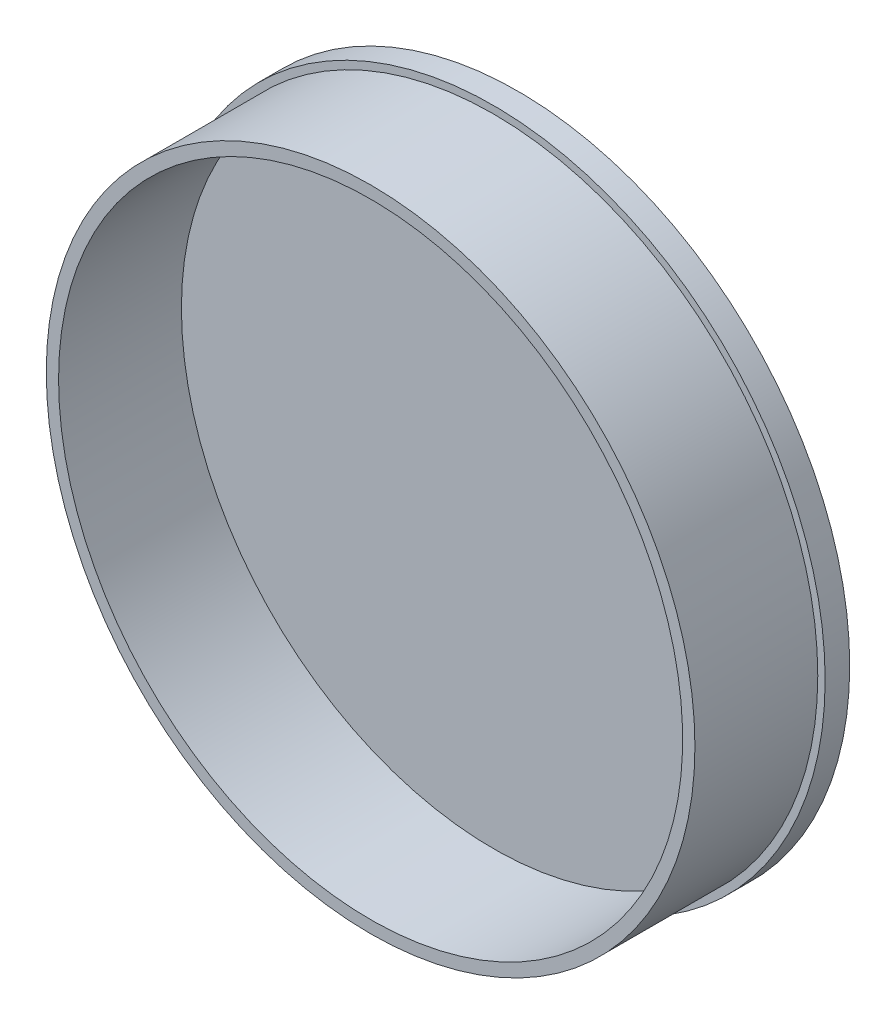
ISO-10303-21;
HEADER;
FILE_DESCRIPTION(('STEP AP214'),'2;1');
FILE_NAME('part.step','',(''),(''),'','','');
FILE_SCHEMA(('AUTOMOTIVE_DESIGN { 1 0 10303 214 1 1 1 1 }'));
ENDSEC;
DATA;
#1=APPLICATION_CONTEXT('core data for automotive mechanical design processes');
#2=APPLICATION_PROTOCOL_DEFINITION('international standard','automotive_design',2000,#1);
#3=PRODUCT_CONTEXT('',#1,'mechanical');
#4=PRODUCT('Part','Part','',(#3));
#5=PRODUCT_RELATED_PRODUCT_CATEGORY('part','',(#4));
#6=PRODUCT_DEFINITION_FORMATION('','',#4);
#7=PRODUCT_DEFINITION_CONTEXT('part definition',#1,'design');
#8=PRODUCT_DEFINITION('design','',#6,#7);
#9=PRODUCT_DEFINITION_SHAPE('','',#8);
#10=(LENGTH_UNIT() NAMED_UNIT(*) SI_UNIT(.MILLI.,.METRE.));
#11=(NAMED_UNIT(*) PLANE_ANGLE_UNIT() SI_UNIT($,.RADIAN.));
#12=(NAMED_UNIT(*) SI_UNIT($,.STERADIAN.) SOLID_ANGLE_UNIT());
#13=UNCERTAINTY_MEASURE_WITH_UNIT(LENGTH_MEASURE(1.E-05),#10,'distance_accuracy_value','');
#14=(GEOMETRIC_REPRESENTATION_CONTEXT(3) GLOBAL_UNCERTAINTY_ASSIGNED_CONTEXT((#13)) GLOBAL_UNIT_ASSIGNED_CONTEXT((#10,
#11,#12)) REPRESENTATION_CONTEXT('',''));
#15=CARTESIAN_POINT('',(0.,0.,0.));
#16=DIRECTION('',(0.,0.,1.));
#17=DIRECTION('',(1.,0.,0.));
#18=AXIS2_PLACEMENT_3D('',#15,#16,#17);
#19=CARTESIAN_POINT('',(0.,0.,5.));
#20=DIRECTION('',(0.,0.,-1.));
#21=DIRECTION('',(-1.,0.,0.));
#22=AXIS2_PLACEMENT_3D('',#19,#20,#21);
#23=CYLINDRICAL_SURFACE('',#22,135.);
#24=CARTESIAN_POINT('',(0.,0.,5.));
#25=DIRECTION('',(0.,0.,1.));
#26=DIRECTION('',(1.,0.,0.));
#27=AXIS2_PLACEMENT_3D('',#24,#25,#26);
#28=CIRCLE('',#27,135.);
#29=CARTESIAN_POINT('',(135.,0.,5.));
#30=VERTEX_POINT('',#29);
#31=EDGE_CURVE('E36',#30,#30,#28,.T.);
#32=ORIENTED_EDGE('',*,*,#31,.F.);
#33=EDGE_LOOP('',(#32));
#34=FACE_BOUND('',#33,.T.);
#35=CARTESIAN_POINT('',(0.,0.,-5.));
#36=DIRECTION('',(0.,0.,1.));
#37=DIRECTION('',(1.,0.,0.));
#38=AXIS2_PLACEMENT_3D('',#35,#36,#37);
#39=CIRCLE('',#38,135.);
#40=CARTESIAN_POINT('',(135.,0.,-5.));
#41=VERTEX_POINT('',#40);
#42=EDGE_CURVE('E40',#41,#41,#39,.T.);
#43=ORIENTED_EDGE('',*,*,#42,.T.);
#44=EDGE_LOOP('',(#43));
#45=FACE_BOUND('',#44,.T.);
#46=ADVANCED_FACE('F30',(#34,#45),#23,.T.);
#47=CARTESIAN_POINT('',(0.,0.,5.));
#48=DIRECTION('',(0.,0.,1.));
#49=DIRECTION('',(1.,0.,0.));
#50=AXIS2_PLACEMENT_3D('',#47,#48,#49);
#51=PLANE('',#50);
#52=CARTESIAN_POINT('',(0.,0.,5.));
#53=DIRECTION('',(0.,0.,1.));
#54=DIRECTION('',(1.,0.,0.));
#55=AXIS2_PLACEMENT_3D('',#52,#53,#54);
#56=CIRCLE('',#55,132.);
#57=CARTESIAN_POINT('',(-132.,0.,5.));
#58=VERTEX_POINT('',#57);
#59=EDGE_CURVE('E47',#58,#58,#56,.T.);
#60=ORIENTED_EDGE('',*,*,#59,.F.);
#61=EDGE_LOOP('',(#60));
#62=FACE_BOUND('',#61,.T.);
#63=ORIENTED_EDGE('',*,*,#31,.T.);
#64=EDGE_LOOP('',(#63));
#65=FACE_BOUND('',#64,.T.);
#66=ADVANCED_FACE('F70',(#62,#65),#51,.T.);
#67=CARTESIAN_POINT('',(0.,0.,-5.));
#68=DIRECTION('',(0.,0.,1.));
#69=DIRECTION('',(1.,0.,0.));
#70=AXIS2_PLACEMENT_3D('',#67,#68,#69);
#71=PLANE('',#70);
#72=ORIENTED_EDGE('',*,*,#42,.F.);
#73=EDGE_LOOP('',(#72));
#74=FACE_BOUND('',#73,.T.);
#75=ADVANCED_FACE('F61',(#74),#71,.F.);
#76=CARTESIAN_POINT('',(0.,0.,55.0000000000001));
#77=DIRECTION('',(0.,0.,1.));
#78=DIRECTION('',(1.,0.,0.));
#79=AXIS2_PLACEMENT_3D('',#76,#77,#78);
#80=PLANE('',#79);
#81=CARTESIAN_POINT('',(0.,0.,55.0000000000001));
#82=DIRECTION('',(0.,0.,1.));
#83=DIRECTION('',(1.,0.,0.));
#84=AXIS2_PLACEMENT_3D('',#81,#82,#83);
#85=CIRCLE('',#84,132.);
#86=CARTESIAN_POINT('',(-132.,0.,55.));
#87=VERTEX_POINT('',#86);
#88=EDGE_CURVE('E45',#87,#87,#85,.T.);
#89=ORIENTED_EDGE('',*,*,#88,.T.);
#90=EDGE_LOOP('',(#89));
#91=FACE_BOUND('',#90,.T.);
#92=CARTESIAN_POINT('',(0.,0.,55.0000000000001));
#93=DIRECTION('',(0.,0.,1.));
#94=DIRECTION('',(1.,0.,0.));
#95=AXIS2_PLACEMENT_3D('',#92,#93,#94);
#96=CIRCLE('',#95,127.);
#97=CARTESIAN_POINT('',(-127.,0.,55.0000000000001));
#98=VERTEX_POINT('',#97);
#99=EDGE_CURVE('E50',#98,#98,#96,.T.);
#100=ORIENTED_EDGE('',*,*,#99,.F.);
#101=EDGE_LOOP('',(#100));
#102=FACE_BOUND('',#101,.T.);
#103=ADVANCED_FACE('F58',(#91,#102),#80,.T.);
#104=CARTESIAN_POINT('',(0.,0.,55.0000000000001));
#105=DIRECTION('',(0.,0.,-1.));
#106=DIRECTION('',(-1.,0.,0.));
#107=AXIS2_PLACEMENT_3D('',#104,#105,#106);
#108=CYLINDRICAL_SURFACE('',#107,132.);
#109=CARTESIAN_POINT('',(-132.,0.,55.));
#110=CARTESIAN_POINT('',(-132.,0.,54.4791666666667));
#111=CARTESIAN_POINT('',(-132.,0.,53.9583333333334));
#112=CARTESIAN_POINT('',(-132.,0.,52.9166666666667));
#113=CARTESIAN_POINT('',(-132.,0.,52.3958333333334));
#114=CARTESIAN_POINT('',(-132.,0.,51.3541666666667));
#115=CARTESIAN_POINT('',(-132.,0.,50.8333333333334));
#116=CARTESIAN_POINT('',(-132.,0.,49.7916666666667));
#117=CARTESIAN_POINT('',(-132.,0.,49.2708333333334));
#118=CARTESIAN_POINT('',(-132.,0.,48.2291666666667));
#119=CARTESIAN_POINT('',(-132.,0.,47.7083333333334));
#120=CARTESIAN_POINT('',(-132.,0.,46.6666666666667));
#121=CARTESIAN_POINT('',(-132.,0.,46.1458333333334));
#122=CARTESIAN_POINT('',(-132.,0.,45.1041666666667));
#123=CARTESIAN_POINT('',(-132.,0.,44.5833333333334));
#124=CARTESIAN_POINT('',(-132.,0.,43.5416666666667));
#125=CARTESIAN_POINT('',(-132.,0.,43.0208333333334));
#126=CARTESIAN_POINT('',(-132.,0.,41.9791666666667));
#127=CARTESIAN_POINT('',(-132.,0.,41.4583333333334));
#128=CARTESIAN_POINT('',(-132.,0.,40.4166666666667));
#129=CARTESIAN_POINT('',(-132.,0.,39.8958333333334));
#130=CARTESIAN_POINT('',(-132.,0.,38.8541666666667));
#131=CARTESIAN_POINT('',(-132.,0.,38.3333333333334));
#132=CARTESIAN_POINT('',(-132.,0.,37.2916666666667));
#133=CARTESIAN_POINT('',(-132.,0.,36.7708333333334));
#134=CARTESIAN_POINT('',(-132.,0.,35.7291666666667));
#135=CARTESIAN_POINT('',(-132.,0.,35.2083333333334));
#136=CARTESIAN_POINT('',(-132.,0.,34.1666666666667));
#137=CARTESIAN_POINT('',(-132.,0.,33.6458333333334));
#138=CARTESIAN_POINT('',(-132.,0.,32.6041666666667));
#139=CARTESIAN_POINT('',(-132.,0.,32.0833333333334));
#140=CARTESIAN_POINT('',(-132.,0.,31.0416666666667));
#141=CARTESIAN_POINT('',(-132.,0.,30.5208333333334));
#142=CARTESIAN_POINT('',(-132.,0.,29.4791666666667));
#143=CARTESIAN_POINT('',(-132.,0.,28.9583333333334));
#144=CARTESIAN_POINT('',(-132.,0.,27.9166666666667));
#145=CARTESIAN_POINT('',(-132.,0.,27.3958333333334));
#146=CARTESIAN_POINT('',(-132.,0.,26.3541666666667));
#147=CARTESIAN_POINT('',(-132.,0.,25.8333333333334));
#148=CARTESIAN_POINT('',(-132.,0.,24.7916666666667));
#149=CARTESIAN_POINT('',(-132.,0.,24.2708333333334));
#150=CARTESIAN_POINT('',(-132.,0.,23.2291666666667));
#151=CARTESIAN_POINT('',(-132.,0.,22.7083333333334));
#152=CARTESIAN_POINT('',(-132.,0.,21.6666666666667));
#153=CARTESIAN_POINT('',(-132.,0.,21.1458333333334));
#154=CARTESIAN_POINT('',(-132.,0.,20.1041666666667));
#155=CARTESIAN_POINT('',(-132.,0.,19.5833333333334));
#156=CARTESIAN_POINT('',(-132.,0.,18.5416666666667));
#157=CARTESIAN_POINT('',(-132.,0.,18.0208333333333));
#158=CARTESIAN_POINT('',(-132.,0.,16.9791666666667));
#159=CARTESIAN_POINT('',(-132.,0.,16.4583333333333));
#160=CARTESIAN_POINT('',(-132.,0.,15.4166666666667));
#161=CARTESIAN_POINT('',(-132.,0.,14.8958333333333));
#162=CARTESIAN_POINT('',(-132.,0.,13.8541666666667));
#163=CARTESIAN_POINT('',(-132.,0.,13.3333333333333));
#164=CARTESIAN_POINT('',(-132.,0.,12.2916666666667));
#165=CARTESIAN_POINT('',(-132.,0.,11.7708333333333));
#166=CARTESIAN_POINT('',(-132.,0.,10.7291666666667));
#167=CARTESIAN_POINT('',(-132.,0.,10.2083333333333));
#168=CARTESIAN_POINT('',(-132.,0.,9.16666666666667));
#169=CARTESIAN_POINT('',(-132.,0.,8.64583333333334));
#170=CARTESIAN_POINT('',(-132.,0.,7.60416666666667));
#171=CARTESIAN_POINT('',(-132.,0.,7.08333333333334));
#172=CARTESIAN_POINT('',(-132.,0.,6.04166666666667));
#173=CARTESIAN_POINT('',(-132.,0.,5.52083333333334));
#174=CARTESIAN_POINT('',(-132.,0.,5.));
#175=B_SPLINE_CURVE_WITH_KNOTS('',3,(#109,#110,#111,#112,#113,#114,#115,#116,#117,#118,#119,
#120,#121,#122,#123,#124,#125,#126,#127,#128,#129,#130,#131,#132,#133,#134,#135,#136,#137,#138,
#139,#140,#141,#142,#143,#144,#145,#146,#147,#148,#149,#150,#151,#152,#153,#154,#155,#156,#157,
#158,#159,#160,#161,#162,#163,#164,#165,#166,#167,#168,#169,#170,#171,#172,#173,#174),
.UNSPECIFIED.,.F.,.F.,(4,2,2,2,2,2,2,2,2,2,2,2,2,2,2,2,2,2,2,2,2,2,2,2,2,2,2,2,2,2,2,2,4),(0.,
1.56249999999999,3.125,4.6875,6.25000000000001,7.8125,9.37500000000001,10.9375,12.5,14.0625,
15.625,17.1875,18.75,20.3125,21.875,23.4375,25.,26.5625,28.125,29.6875,31.25,32.8125,34.375,
35.9375,37.5,39.0625,40.625,42.1875,43.75,45.3125,46.875,48.4375,50.),.UNSPECIFIED.);
#176=EDGE_CURVE('BSEAM60',#87,#58,#175,.T.);
#177=ORIENTED_EDGE('',*,*,#88,.F.);
#178=ORIENTED_EDGE('',*,*,#59,.T.);
#179=ORIENTED_EDGE('',*,*,#176,.T.);
#180=ORIENTED_EDGE('',*,*,#176,.F.);
#181=EDGE_LOOP('',(#177,#179,#178,#180));
#182=FACE_BOUND('',#181,.T.);
#183=ADVANCED_FACE('F60',(#182),#108,.T.);
#184=CARTESIAN_POINT('',(0.,0.,55.0000000000001));
#185=DIRECTION('',(0.,0.,-1.));
#186=DIRECTION('',(-1.,0.,0.));
#187=AXIS2_PLACEMENT_3D('',#184,#185,#186);
#188=CYLINDRICAL_SURFACE('',#187,127.);
#189=CARTESIAN_POINT('',(0.,0.,5.));
#190=DIRECTION('',(0.,0.,1.));
#191=DIRECTION('',(1.,0.,0.));
#192=AXIS2_PLACEMENT_3D('',#189,#190,#191);
#193=CIRCLE('',#192,127.);
#194=CARTESIAN_POINT('',(-127.,0.,4.99999999999999));
#195=VERTEX_POINT('',#194);
#196=EDGE_CURVE('E10',#195,#195,#193,.F.);
#197=CARTESIAN_POINT('',(-127.,0.,55.0000000000001));
#198=CARTESIAN_POINT('',(-127.,0.,54.4791666666667));
#199=CARTESIAN_POINT('',(-127.,0.,53.9583333333334));
#200=CARTESIAN_POINT('',(-127.,0.,52.9166666666667));
#201=CARTESIAN_POINT('',(-127.,0.,52.3958333333334));
#202=CARTESIAN_POINT('',(-127.,0.,51.3541666666667));
#203=CARTESIAN_POINT('',(-127.,0.,50.8333333333334));
#204=CARTESIAN_POINT('',(-127.,0.,49.7916666666667));
#205=CARTESIAN_POINT('',(-127.,0.,49.2708333333334));
#206=CARTESIAN_POINT('',(-127.,0.,48.2291666666667));
#207=CARTESIAN_POINT('',(-127.,0.,47.7083333333334));
#208=CARTESIAN_POINT('',(-127.,0.,46.6666666666667));
#209=CARTESIAN_POINT('',(-127.,0.,46.1458333333334));
#210=CARTESIAN_POINT('',(-127.,0.,45.1041666666667));
#211=CARTESIAN_POINT('',(-127.,0.,44.5833333333334));
#212=CARTESIAN_POINT('',(-127.,0.,43.5416666666667));
#213=CARTESIAN_POINT('',(-127.,0.,43.0208333333334));
#214=CARTESIAN_POINT('',(-127.,0.,41.9791666666667));
#215=CARTESIAN_POINT('',(-127.,0.,41.4583333333334));
#216=CARTESIAN_POINT('',(-127.,0.,40.4166666666667));
#217=CARTESIAN_POINT('',(-127.,0.,39.8958333333334));
#218=CARTESIAN_POINT('',(-127.,0.,38.8541666666667));
#219=CARTESIAN_POINT('',(-127.,0.,38.3333333333334));
#220=CARTESIAN_POINT('',(-127.,0.,37.2916666666667));
#221=CARTESIAN_POINT('',(-127.,0.,36.7708333333334));
#222=CARTESIAN_POINT('',(-127.,0.,35.7291666666667));
#223=CARTESIAN_POINT('',(-127.,0.,35.2083333333334));
#224=CARTESIAN_POINT('',(-127.,0.,34.1666666666667));
#225=CARTESIAN_POINT('',(-127.,0.,33.6458333333334));
#226=CARTESIAN_POINT('',(-127.,0.,32.6041666666667));
#227=CARTESIAN_POINT('',(-127.,0.,32.0833333333333));
#228=CARTESIAN_POINT('',(-127.,0.,31.0416666666667));
#229=CARTESIAN_POINT('',(-127.,0.,30.5208333333334));
#230=CARTESIAN_POINT('',(-127.,0.,29.4791666666667));
#231=CARTESIAN_POINT('',(-127.,0.,28.9583333333334));
#232=CARTESIAN_POINT('',(-127.,0.,27.9166666666667));
#233=CARTESIAN_POINT('',(-127.,0.,27.3958333333334));
#234=CARTESIAN_POINT('',(-127.,0.,26.3541666666667));
#235=CARTESIAN_POINT('',(-127.,0.,25.8333333333333));
#236=CARTESIAN_POINT('',(-127.,0.,24.7916666666667));
#237=CARTESIAN_POINT('',(-127.,0.,24.2708333333334));
#238=CARTESIAN_POINT('',(-127.,0.,23.2291666666667));
#239=CARTESIAN_POINT('',(-127.,0.,22.7083333333333));
#240=CARTESIAN_POINT('',(-127.,0.,21.6666666666667));
#241=CARTESIAN_POINT('',(-127.,0.,21.1458333333333));
#242=CARTESIAN_POINT('',(-127.,0.,20.1041666666667));
#243=CARTESIAN_POINT('',(-127.,0.,19.5833333333333));
#244=CARTESIAN_POINT('',(-127.,0.,18.5416666666667));
#245=CARTESIAN_POINT('',(-127.,0.,18.0208333333333));
#246=CARTESIAN_POINT('',(-127.,0.,16.9791666666667));
#247=CARTESIAN_POINT('',(-127.,0.,16.4583333333333));
#248=CARTESIAN_POINT('',(-127.,0.,15.4166666666667));
#249=CARTESIAN_POINT('',(-127.,0.,14.8958333333333));
#250=CARTESIAN_POINT('',(-127.,0.,13.8541666666667));
#251=CARTESIAN_POINT('',(-127.,0.,13.3333333333333));
#252=CARTESIAN_POINT('',(-127.,0.,12.2916666666667));
#253=CARTESIAN_POINT('',(-127.,0.,11.7708333333333));
#254=CARTESIAN_POINT('',(-127.,0.,10.7291666666667));
#255=CARTESIAN_POINT('',(-127.,0.,10.2083333333333));
#256=CARTESIAN_POINT('',(-127.,0.,9.16666666666666));
#257=CARTESIAN_POINT('',(-127.,0.,8.64583333333333));
#258=CARTESIAN_POINT('',(-127.,0.,7.60416666666666));
#259=CARTESIAN_POINT('',(-127.,0.,7.08333333333333));
#260=CARTESIAN_POINT('',(-127.,0.,6.04166666666666));
#261=CARTESIAN_POINT('',(-127.,0.,5.52083333333333));
#262=CARTESIAN_POINT('',(-127.,0.,4.99999999999999));
#263=B_SPLINE_CURVE_WITH_KNOTS('',3,(#197,#198,#199,#200,#201,#202,#203,#204,#205,#206,#207,
#208,#209,#210,#211,#212,#213,#214,#215,#216,#217,#218,#219,#220,#221,#222,#223,#224,#225,#226,
#227,#228,#229,#230,#231,#232,#233,#234,#235,#236,#237,#238,#239,#240,#241,#242,#243,#244,#245,
#246,#247,#248,#249,#250,#251,#252,#253,#254,#255,#256,#257,#258,#259,#260,#261,#262),
.UNSPECIFIED.,.F.,.F.,(4,2,2,2,2,2,2,2,2,2,2,2,2,2,2,2,2,2,2,2,2,2,2,2,2,2,2,2,2,2,2,2,4),(0.,
1.56250000000001,3.12500000000001,4.68750000000001,6.25000000000001,7.81250000000001,
9.37500000000002,10.9375,12.5,14.0625,15.625,17.1875,18.75,20.3125,21.875,23.4375,25.,26.5625,
28.125,29.6875,31.25,32.8125,34.375,35.9375,37.5,39.0625,40.625,42.1875,43.7500000000001,
45.3125000000001,46.8750000000001,48.4375000000001,50.0000000000001),.UNSPECIFIED.);
#264=EDGE_CURVE('BSEAM56',#98,#195,#263,.T.);
#265=ORIENTED_EDGE('',*,*,#99,.T.);
#266=ORIENTED_EDGE('',*,*,#196,.T.);
#267=ORIENTED_EDGE('',*,*,#264,.T.);
#268=ORIENTED_EDGE('',*,*,#264,.F.);
#269=EDGE_LOOP('',(#265,#267,#266,#268));
#270=FACE_BOUND('',#269,.T.);
#271=ADVANCED_FACE('F56',(#270),#188,.F.);
#272=ORIENTED_EDGE('',*,*,#196,.F.);
#273=EDGE_LOOP('',(#272));
#274=FACE_BOUND('',#273,.T.);
#275=ADVANCED_FACE('F80',(#274),#51,.T.);
#276=CLOSED_SHELL('',(#46,#66,#75,#103,#183,#271,#275));
#277=MANIFOLD_SOLID_BREP('B2',#276);
#278=ADVANCED_BREP_SHAPE_REPRESENTATION('',(#18,#277),#14);
#279=SHAPE_DEFINITION_REPRESENTATION(#9,#278);
ENDSEC;
END-ISO-10303-21;
